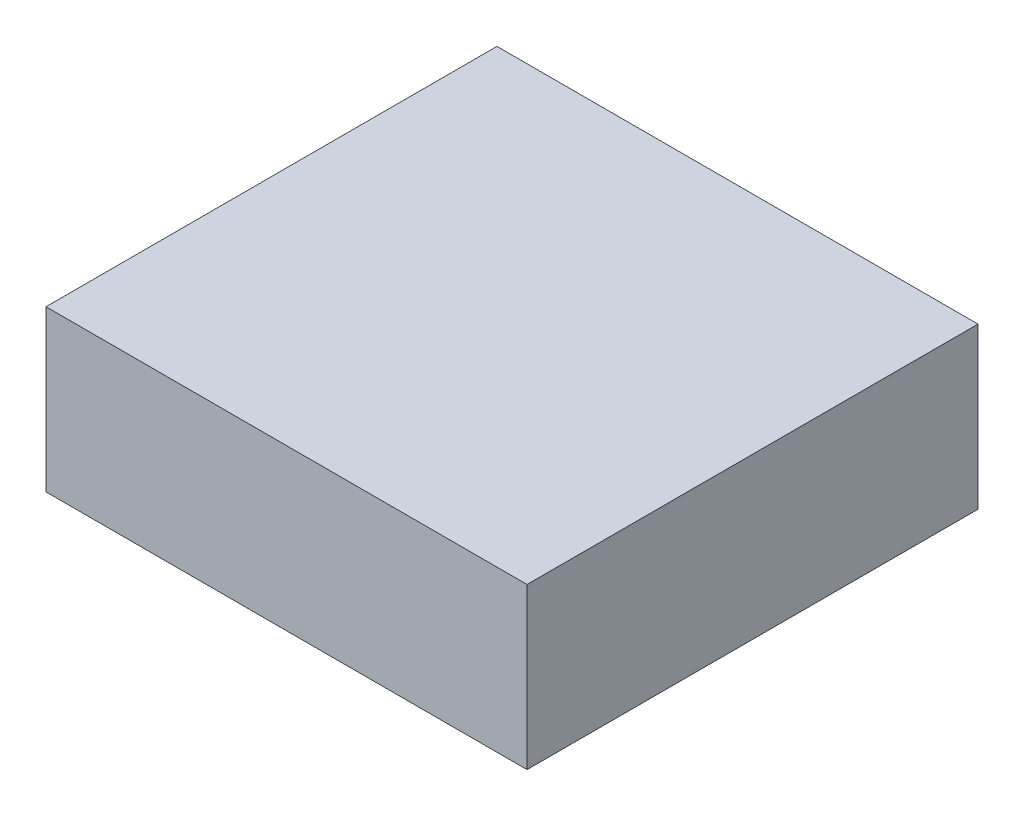
ISO-10303-21;
HEADER;
FILE_DESCRIPTION(('STEP AP214'),'2;1');
FILE_NAME('part.step','',(''),(''),'','','');
FILE_SCHEMA(('AUTOMOTIVE_DESIGN { 1 0 10303 214 1 1 1 1 }'));
ENDSEC;
DATA;
#1=APPLICATION_CONTEXT('core data for automotive mechanical design processes');
#2=APPLICATION_PROTOCOL_DEFINITION('international standard','automotive_design',2000,#1);
#3=PRODUCT_CONTEXT('',#1,'mechanical');
#4=PRODUCT('Part','Part','',(#3));
#5=PRODUCT_RELATED_PRODUCT_CATEGORY('part','',(#4));
#6=PRODUCT_DEFINITION_FORMATION('','',#4);
#7=PRODUCT_DEFINITION_CONTEXT('part definition',#1,'design');
#8=PRODUCT_DEFINITION('design','',#6,#7);
#9=PRODUCT_DEFINITION_SHAPE('','',#8);
#10=(LENGTH_UNIT() NAMED_UNIT(*) SI_UNIT(.MILLI.,.METRE.));
#11=(NAMED_UNIT(*) PLANE_ANGLE_UNIT() SI_UNIT($,.RADIAN.));
#12=(NAMED_UNIT(*) SI_UNIT($,.STERADIAN.) SOLID_ANGLE_UNIT());
#13=UNCERTAINTY_MEASURE_WITH_UNIT(LENGTH_MEASURE(1.E-05),#10,'distance_accuracy_value','');
#14=(GEOMETRIC_REPRESENTATION_CONTEXT(3) GLOBAL_UNCERTAINTY_ASSIGNED_CONTEXT((#13)) GLOBAL_UNIT_ASSIGNED_CONTEXT((#10,
#11,#12)) REPRESENTATION_CONTEXT('',''));
#15=CARTESIAN_POINT('',(0.,0.,0.));
#16=DIRECTION('',(0.,0.,1.));
#17=DIRECTION('',(1.,0.,0.));
#18=AXIS2_PLACEMENT_3D('',#15,#16,#17);
#19=CARTESIAN_POINT('',(-48.,32.,45.));
#20=DIRECTION('',(1.,0.,0.));
#21=DIRECTION('',(0.,0.,-1.));
#22=AXIS2_PLACEMENT_3D('',#19,#20,#21);
#23=PLANE('',#22);
#24=DIRECTION('',(0.,0.,1.));
#25=VECTOR('',#24,1.);
#26=CARTESIAN_POINT('',(-48.,0.,45.));
#27=LINE('',#26,#25);
#28=CARTESIAN_POINT('',(-48.,0.,-45.));
#29=VERTEX_POINT('',#28);
#30=CARTESIAN_POINT('',(-48.,0.,45.));
#31=VERTEX_POINT('',#30);
#32=EDGE_CURVE('E99',#29,#31,#27,.T.);
#33=ORIENTED_EDGE('',*,*,#32,.T.);
#34=DIRECTION('',(0.,-1.,0.));
#35=VECTOR('',#34,1.);
#36=CARTESIAN_POINT('',(-48.,32.,45.));
#37=LINE('',#36,#35);
#38=CARTESIAN_POINT('',(-48.,32.,45.));
#39=VERTEX_POINT('',#38);
#40=EDGE_CURVE('E11',#39,#31,#37,.T.);
#41=ORIENTED_EDGE('',*,*,#40,.F.);
#42=DIRECTION('',(0.,0.,1.));
#43=VECTOR('',#42,1.);
#44=CARTESIAN_POINT('',(-48.,32.,45.));
#45=LINE('',#44,#43);
#46=CARTESIAN_POINT('',(-48.,32.,-45.));
#47=VERTEX_POINT('',#46);
#48=EDGE_CURVE('E87',#47,#39,#45,.T.);
#49=ORIENTED_EDGE('',*,*,#48,.F.);
#50=DIRECTION('',(0.,-1.,0.));
#51=VECTOR('',#50,1.);
#52=CARTESIAN_POINT('',(-48.,32.,-45.));
#53=LINE('',#52,#51);
#54=EDGE_CURVE('E95',#47,#29,#53,.T.);
#55=ORIENTED_EDGE('',*,*,#54,.T.);
#56=EDGE_LOOP('',(#33,#41,#49,#55));
#57=FACE_BOUND('',#56,.T.);
#58=ADVANCED_FACE('F36',(#57),#23,.F.);
#59=CARTESIAN_POINT('',(48.,32.,45.));
#60=DIRECTION('',(0.,0.,-1.));
#61=DIRECTION('',(-1.,0.,0.));
#62=AXIS2_PLACEMENT_3D('',#59,#60,#61);
#63=PLANE('',#62);
#64=DIRECTION('',(1.,0.,0.));
#65=VECTOR('',#64,1.);
#66=CARTESIAN_POINT('',(48.,0.,45.));
#67=LINE('',#66,#65);
#68=CARTESIAN_POINT('',(48.,0.,45.));
#69=VERTEX_POINT('',#68);
#70=EDGE_CURVE('E91',#31,#69,#67,.T.);
#71=ORIENTED_EDGE('',*,*,#70,.T.);
#72=DIRECTION('',(0.,-1.,0.));
#73=VECTOR('',#72,1.);
#74=CARTESIAN_POINT('',(48.,32.,45.));
#75=LINE('',#74,#73);
#76=CARTESIAN_POINT('',(48.,32.,45.));
#77=VERTEX_POINT('',#76);
#78=EDGE_CURVE('E44',#77,#69,#75,.T.);
#79=ORIENTED_EDGE('',*,*,#78,.F.);
#80=DIRECTION('',(1.,0.,0.));
#81=VECTOR('',#80,1.);
#82=CARTESIAN_POINT('',(48.,32.,45.));
#83=LINE('',#82,#81);
#84=EDGE_CURVE('E82',#39,#77,#83,.T.);
#85=ORIENTED_EDGE('',*,*,#84,.F.);
#86=ORIENTED_EDGE('',*,*,#40,.T.);
#87=EDGE_LOOP('',(#71,#79,#85,#86));
#88=FACE_BOUND('',#87,.T.);
#89=ADVANCED_FACE('F90',(#88),#63,.F.);
#90=CARTESIAN_POINT('',(48.,32.,45.));
#91=DIRECTION('',(-1.,0.,0.));
#92=DIRECTION('',(0.,0.,1.));
#93=AXIS2_PLACEMENT_3D('',#90,#91,#92);
#94=PLANE('',#93);
#95=DIRECTION('',(0.,0.,-1.));
#96=VECTOR('',#95,1.);
#97=CARTESIAN_POINT('',(48.,0.,45.));
#98=LINE('',#97,#96);
#99=CARTESIAN_POINT('',(48.,0.,-45.));
#100=VERTEX_POINT('',#99);
#101=EDGE_CURVE('E69',#69,#100,#98,.T.);
#102=ORIENTED_EDGE('',*,*,#101,.T.);
#103=DIRECTION('',(0.,-1.,0.));
#104=VECTOR('',#103,1.);
#105=CARTESIAN_POINT('',(48.,32.,-45.));
#106=LINE('',#105,#104);
#107=CARTESIAN_POINT('',(48.,32.,-45.));
#108=VERTEX_POINT('',#107);
#109=EDGE_CURVE('E92',#108,#100,#106,.T.);
#110=ORIENTED_EDGE('',*,*,#109,.F.);
#111=DIRECTION('',(0.,0.,-1.));
#112=VECTOR('',#111,1.);
#113=CARTESIAN_POINT('',(48.,32.,45.));
#114=LINE('',#113,#112);
#115=EDGE_CURVE('E85',#77,#108,#114,.T.);
#116=ORIENTED_EDGE('',*,*,#115,.F.);
#117=ORIENTED_EDGE('',*,*,#78,.T.);
#118=EDGE_LOOP('',(#102,#110,#116,#117));
#119=FACE_BOUND('',#118,.T.);
#120=ADVANCED_FACE('F93',(#119),#94,.F.);
#121=CARTESIAN_POINT('',(48.,32.,-45.));
#122=DIRECTION('',(0.,0.,1.));
#123=DIRECTION('',(1.,0.,0.));
#124=AXIS2_PLACEMENT_3D('',#121,#122,#123);
#125=PLANE('',#124);
#126=DIRECTION('',(-1.,0.,0.));
#127=VECTOR('',#126,1.);
#128=CARTESIAN_POINT('',(48.,0.,-45.));
#129=LINE('',#128,#127);
#130=EDGE_CURVE('E75',#100,#29,#129,.T.);
#131=ORIENTED_EDGE('',*,*,#130,.T.);
#132=ORIENTED_EDGE('',*,*,#54,.F.);
#133=DIRECTION('',(-1.,0.,0.));
#134=VECTOR('',#133,1.);
#135=CARTESIAN_POINT('',(48.,32.,-45.));
#136=LINE('',#135,#134);
#137=EDGE_CURVE('E52',#108,#47,#136,.T.);
#138=ORIENTED_EDGE('',*,*,#137,.F.);
#139=ORIENTED_EDGE('',*,*,#109,.T.);
#140=EDGE_LOOP('',(#131,#132,#138,#139));
#141=FACE_BOUND('',#140,.T.);
#142=ADVANCED_FACE('F106',(#141),#125,.F.);
#143=CARTESIAN_POINT('',(0.,32.,0.));
#144=DIRECTION('',(0.,1.,0.));
#145=DIRECTION('',(0.,0.,1.));
#146=AXIS2_PLACEMENT_3D('',#143,#144,#145);
#147=PLANE('',#146);
#148=ORIENTED_EDGE('',*,*,#48,.T.);
#149=ORIENTED_EDGE('',*,*,#84,.T.);
#150=ORIENTED_EDGE('',*,*,#115,.T.);
#151=ORIENTED_EDGE('',*,*,#137,.T.);
#152=EDGE_LOOP('',(#148,#149,#150,#151));
#153=FACE_BOUND('',#152,.T.);
#154=ADVANCED_FACE('F83',(#153),#147,.T.);
#155=CARTESIAN_POINT('',(0.,0.,0.));
#156=DIRECTION('',(0.,1.,0.));
#157=DIRECTION('',(0.,0.,1.));
#158=AXIS2_PLACEMENT_3D('',#155,#156,#157);
#159=PLANE('',#158);
#160=ORIENTED_EDGE('',*,*,#32,.F.);
#161=ORIENTED_EDGE('',*,*,#130,.F.);
#162=ORIENTED_EDGE('',*,*,#101,.F.);
#163=ORIENTED_EDGE('',*,*,#70,.F.);
#164=EDGE_LOOP('',(#160,#161,#162,#163));
#165=FACE_BOUND('',#164,.T.);
#166=ADVANCED_FACE('F109',(#165),#159,.F.);
#167=CLOSED_SHELL('',(#58,#89,#120,#142,#154,#166));
#168=MANIFOLD_SOLID_BREP('B2',#167);
#169=ADVANCED_BREP_SHAPE_REPRESENTATION('',(#18,#168),#14);
#170=SHAPE_DEFINITION_REPRESENTATION(#9,#169);
ENDSEC;
END-ISO-10303-21;
